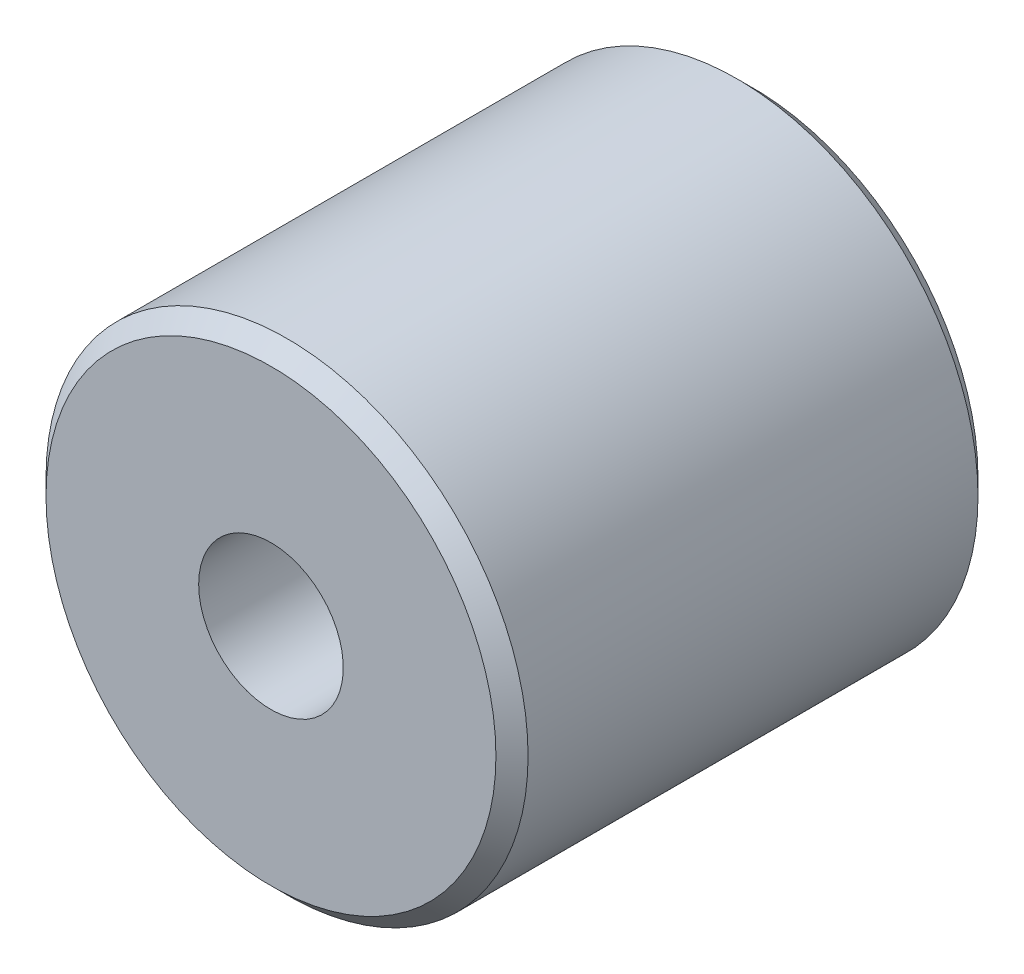
ISO-10303-21;
HEADER;
FILE_DESCRIPTION(('STEP AP214'),'2;1');
FILE_NAME('part.step','',(''),(''),'','','');
FILE_SCHEMA(('AUTOMOTIVE_DESIGN { 1 0 10303 214 1 1 1 1 }'));
ENDSEC;
DATA;
#1=APPLICATION_CONTEXT('core data for automotive mechanical design processes');
#2=APPLICATION_PROTOCOL_DEFINITION('international standard','automotive_design',2000,#1);
#3=PRODUCT_CONTEXT('',#1,'mechanical');
#4=PRODUCT('Part','Part','',(#3));
#5=PRODUCT_RELATED_PRODUCT_CATEGORY('part','',(#4));
#6=PRODUCT_DEFINITION_FORMATION('','',#4);
#7=PRODUCT_DEFINITION_CONTEXT('part definition',#1,'design');
#8=PRODUCT_DEFINITION('design','',#6,#7);
#9=PRODUCT_DEFINITION_SHAPE('','',#8);
#10=(LENGTH_UNIT() NAMED_UNIT(*) SI_UNIT(.MILLI.,.METRE.));
#11=(NAMED_UNIT(*) PLANE_ANGLE_UNIT() SI_UNIT($,.RADIAN.));
#12=(NAMED_UNIT(*) SI_UNIT($,.STERADIAN.) SOLID_ANGLE_UNIT());
#13=UNCERTAINTY_MEASURE_WITH_UNIT(LENGTH_MEASURE(1.E-05),#10,'distance_accuracy_value','');
#14=(GEOMETRIC_REPRESENTATION_CONTEXT(3) GLOBAL_UNCERTAINTY_ASSIGNED_CONTEXT((#13)) GLOBAL_UNIT_ASSIGNED_CONTEXT((#10,
#11,#12)) REPRESENTATION_CONTEXT('',''));
#15=CARTESIAN_POINT('',(0.,0.,0.));
#16=DIRECTION('',(0.,0.,1.));
#17=DIRECTION('',(1.,0.,0.));
#18=AXIS2_PLACEMENT_3D('',#15,#16,#17);
#19=CARTESIAN_POINT('',(-1.11022302462516E-13,-1.66533453693773E-13,0.));
#20=DIRECTION('',(0.,0.,-0.999999999999997));
#21=DIRECTION('',(-1.,0.,0.));
#22=AXIS2_PLACEMENT_3D('',#19,#20,#21);
#23=PLANE('',#22);
#24=CARTESIAN_POINT('',(-1.11022302462516E-13,-1.66533453693773E-13,0.));
#25=DIRECTION('',(0.,0.,-0.999999999999997));
#26=DIRECTION('',(-1.,0.,0.));
#27=AXIS2_PLACEMENT_3D('',#24,#25,#26);
#28=CIRCLE('',#27,14.);
#29=CARTESIAN_POINT('',(-14.0000000000001,-1.67116320781702E-13,0.));
#30=VERTEX_POINT('',#29);
#31=EDGE_CURVE('E62',#30,#30,#28,.F.);
#32=ORIENTED_EDGE('',*,*,#31,.T.);
#33=EDGE_LOOP('',(#32));
#34=FACE_BOUND('',#33,.T.);
#35=CARTESIAN_POINT('',(-1.11022302462516E-13,-1.66533453693773E-13,8.88178419700125E-13));
#36=DIRECTION('',(0.,0.,-0.999999999999997));
#37=DIRECTION('',(-1.,0.,0.));
#38=AXIS2_PLACEMENT_3D('',#35,#36,#37);
#39=CIRCLE('',#38,4.49999999999999);
#40=CARTESIAN_POINT('',(-4.50000000000009,-1.66720803829179E-13,8.84708972748172E-13));
#41=VERTEX_POINT('',#40);
#42=EDGE_CURVE('E76',#41,#41,#39,.T.);
#43=ORIENTED_EDGE('',*,*,#42,.T.);
#44=EDGE_LOOP('',(#43));
#45=FACE_BOUND('',#44,.T.);
#46=ADVANCED_FACE('F47',(#34,#45),#23,.F.);
#47=CARTESIAN_POINT('',(0.,-1.66533453693773E-13,2.83151327074194));
#48=DIRECTION('',(0.,0.,0.999999999999997));
#49=DIRECTION('',(1.,0.,0.));
#50=AXIS2_PLACEMENT_3D('',#47,#48,#49);
#51=CYLINDRICAL_SURFACE('',#50,15.);
#52=CARTESIAN_POINT('',(-1.11022302462516E-13,-1.66533453693773E-13,-1.00000000000033));
#53=DIRECTION('',(0.,0.,-0.999999999999997));
#54=DIRECTION('',(-1.,0.,0.));
#55=AXIS2_PLACEMENT_3D('',#52,#53,#54);
#56=CIRCLE('',#55,15.);
#57=CARTESIAN_POINT('',(14.9999999999999,-1.65908953242422E-13,-1.00000000000033));
#58=VERTEX_POINT('',#57);
#59=EDGE_CURVE('E54',#58,#58,#56,.T.);
#60=CARTESIAN_POINT('',(0.,-1.66533453693773E-13,-28.9999999999999));
#61=DIRECTION('',(0.,0.,0.999999999999997));
#62=DIRECTION('',(1.,0.,0.));
#63=AXIS2_PLACEMENT_3D('',#60,#61,#62);
#64=CIRCLE('',#63,15.);
#65=CARTESIAN_POINT('',(14.9999999999999,-1.65908953242422E-13,-28.9999999999999));
#66=VERTEX_POINT('',#65);
#67=EDGE_CURVE('E58',#66,#66,#64,.T.);
#68=CARTESIAN_POINT('',(14.9999999999999,-1.65908953242422E-13,-1.00000000000033));
#69=CARTESIAN_POINT('',(14.9999999999999,-1.65908953242422E-13,-1.291666666667));
#70=CARTESIAN_POINT('',(14.9999999999999,-1.65908953242422E-13,-1.58333333333366));
#71=CARTESIAN_POINT('',(14.9999999999999,-1.65908953242422E-13,-2.16666666666698));
#72=CARTESIAN_POINT('',(14.9999999999999,-1.65908953242422E-13,-2.45833333333365));
#73=CARTESIAN_POINT('',(14.9999999999999,-1.65908953242422E-13,-3.04166666666697));
#74=CARTESIAN_POINT('',(14.9999999999999,-1.65908953242422E-13,-3.33333333333363));
#75=CARTESIAN_POINT('',(14.9999999999999,-1.65908953242422E-13,-3.91666666666696));
#76=CARTESIAN_POINT('',(14.9999999999999,-1.65908953242422E-13,-4.20833333333362));
#77=CARTESIAN_POINT('',(14.9999999999999,-1.65908953242422E-13,-4.79166666666694));
#78=CARTESIAN_POINT('',(14.9999999999999,-1.65908953242422E-13,-5.0833333333336));
#79=CARTESIAN_POINT('',(14.9999999999999,-1.65908953242422E-13,-5.66666666666693));
#80=CARTESIAN_POINT('',(14.9999999999999,-1.65908953242422E-13,-5.95833333333359));
#81=CARTESIAN_POINT('',(14.9999999999999,-1.65908953242422E-13,-6.54166666666692));
#82=CARTESIAN_POINT('',(14.9999999999999,-1.65908953242422E-13,-6.83333333333358));
#83=CARTESIAN_POINT('',(14.9999999999999,-1.65908953242422E-13,-7.4166666666669));
#84=CARTESIAN_POINT('',(14.9999999999999,-1.65908953242422E-13,-7.70833333333357));
#85=CARTESIAN_POINT('',(14.9999999999999,-1.65908953242422E-13,-8.29166666666689));
#86=CARTESIAN_POINT('',(14.9999999999999,-1.65908953242422E-13,-8.58333333333355));
#87=CARTESIAN_POINT('',(14.9999999999999,-1.65908953242422E-13,-9.16666666666688));
#88=CARTESIAN_POINT('',(14.9999999999999,-1.65908953242422E-13,-9.45833333333354));
#89=CARTESIAN_POINT('',(14.9999999999999,-1.65908953242422E-13,-10.0416666666669));
#90=CARTESIAN_POINT('',(14.9999999999999,-1.65908953242422E-13,-10.3333333333335));
#91=CARTESIAN_POINT('',(14.9999999999999,-1.65908953242422E-13,-10.9166666666669));
#92=CARTESIAN_POINT('',(14.9999999999999,-1.65908953242422E-13,-11.2083333333335));
#93=CARTESIAN_POINT('',(14.9999999999999,-1.65908953242422E-13,-11.7916666666668));
#94=CARTESIAN_POINT('',(14.9999999999999,-1.65908953242422E-13,-12.0833333333335));
#95=CARTESIAN_POINT('',(14.9999999999999,-1.65908953242422E-13,-12.6666666666668));
#96=CARTESIAN_POINT('',(14.9999999999999,-1.65908953242422E-13,-12.9583333333335));
#97=CARTESIAN_POINT('',(14.9999999999999,-1.65908953242422E-13,-13.5416666666668));
#98=CARTESIAN_POINT('',(14.9999999999999,-1.65908953242422E-13,-13.8333333333335));
#99=CARTESIAN_POINT('',(14.9999999999999,-1.65908953242422E-13,-14.4166666666668));
#100=CARTESIAN_POINT('',(14.9999999999999,-1.65908953242422E-13,-14.7083333333335));
#101=CARTESIAN_POINT('',(14.9999999999999,-1.65908953242422E-13,-15.2916666666668));
#102=CARTESIAN_POINT('',(14.9999999999999,-1.65908953242422E-13,-15.5833333333334));
#103=CARTESIAN_POINT('',(14.9999999999999,-1.65908953242422E-13,-16.1666666666668));
#104=CARTESIAN_POINT('',(14.9999999999999,-1.65908953242422E-13,-16.4583333333334));
#105=CARTESIAN_POINT('',(14.9999999999999,-1.65908953242422E-13,-17.0416666666668));
#106=CARTESIAN_POINT('',(14.9999999999999,-1.65908953242422E-13,-17.3333333333334));
#107=CARTESIAN_POINT('',(14.9999999999999,-1.65908953242422E-13,-17.9166666666667));
#108=CARTESIAN_POINT('',(14.9999999999999,-1.65908953242422E-13,-18.2083333333334));
#109=CARTESIAN_POINT('',(14.9999999999999,-1.65908953242422E-13,-18.7916666666667));
#110=CARTESIAN_POINT('',(14.9999999999999,-1.65908953242422E-13,-19.0833333333334));
#111=CARTESIAN_POINT('',(14.9999999999999,-1.65908953242422E-13,-19.6666666666667));
#112=CARTESIAN_POINT('',(14.9999999999999,-1.65908953242422E-13,-19.9583333333334));
#113=CARTESIAN_POINT('',(14.9999999999999,-1.65908953242422E-13,-20.5416666666667));
#114=CARTESIAN_POINT('',(14.9999999999999,-1.65908953242422E-13,-20.8333333333334));
#115=CARTESIAN_POINT('',(14.9999999999999,-1.65908953242422E-13,-21.4166666666667));
#116=CARTESIAN_POINT('',(14.9999999999999,-1.65908953242422E-13,-21.7083333333334));
#117=CARTESIAN_POINT('',(14.9999999999999,-1.65908953242422E-13,-22.2916666666667));
#118=CARTESIAN_POINT('',(14.9999999999999,-1.65908953242422E-13,-22.5833333333333));
#119=CARTESIAN_POINT('',(14.9999999999999,-1.65908953242422E-13,-23.1666666666667));
#120=CARTESIAN_POINT('',(14.9999999999999,-1.65908953242422E-13,-23.4583333333333));
#121=CARTESIAN_POINT('',(14.9999999999999,-1.65908953242422E-13,-24.0416666666667));
#122=CARTESIAN_POINT('',(14.9999999999999,-1.65908953242422E-13,-24.3333333333333));
#123=CARTESIAN_POINT('',(14.9999999999999,-1.65908953242422E-13,-24.9166666666666));
#124=CARTESIAN_POINT('',(14.9999999999999,-1.65908953242422E-13,-25.2083333333333));
#125=CARTESIAN_POINT('',(14.9999999999999,-1.65908953242422E-13,-25.7916666666666));
#126=CARTESIAN_POINT('',(14.9999999999999,-1.65908953242422E-13,-26.0833333333333));
#127=CARTESIAN_POINT('',(14.9999999999999,-1.65908953242422E-13,-26.6666666666666));
#128=CARTESIAN_POINT('',(14.9999999999999,-1.65908953242422E-13,-26.9583333333333));
#129=CARTESIAN_POINT('',(14.9999999999999,-1.65908953242422E-13,-27.5416666666666));
#130=CARTESIAN_POINT('',(14.9999999999999,-1.65908953242422E-13,-27.8333333333333));
#131=CARTESIAN_POINT('',(14.9999999999999,-1.65908953242422E-13,-28.4166666666666));
#132=CARTESIAN_POINT('',(14.9999999999999,-1.65908953242422E-13,-28.7083333333333));
#133=CARTESIAN_POINT('',(14.9999999999999,-1.65908953242422E-13,-28.9999999999999));
#134=B_SPLINE_CURVE_WITH_KNOTS('',3,(#68,#69,#70,#71,#72,#73,#74,#75,#76,#77,#78,#79,#80,#81,
#82,#83,#84,#85,#86,#87,#88,#89,#90,#91,#92,#93,#94,#95,#96,#97,#98,#99,#100,#101,#102,#103,
#104,#105,#106,#107,#108,#109,#110,#111,#112,#113,#114,#115,#116,#117,#118,#119,#120,#121,#122,
#123,#124,#125,#126,#127,#128,#129,#130,#131,#132,#133),.UNSPECIFIED.,.F.,.F.,(4,2,2,2,2,2,2,2,
2,2,2,2,2,2,2,2,2,2,2,2,2,2,2,2,2,2,2,2,2,2,2,2,4),(0.,0.874999999999988,1.74999999999997,
2.62499999999996,3.49999999999995,4.37499999999993,5.24999999999992,6.12499999999991,
6.99999999999989,7.87499999999988,8.74999999999987,9.62499999999985,10.4999999999998,
11.3749999999998,12.2499999999998,13.1249999999998,13.9999999999998,14.8749999999998,
15.7499999999998,16.6249999999997,17.4999999999997,18.3749999999997,19.2499999999997,
20.1249999999997,20.9999999999997,21.8749999999997,22.7499999999997,23.6249999999996,
24.4999999999996,25.3749999999996,26.2499999999996,27.1249999999996,27.9999999999996),.UNSPECIFIED.);
#135=EDGE_CURVE('BSEAM102',#58,#66,#134,.T.);
#136=ORIENTED_EDGE('',*,*,#59,.T.);
#137=ORIENTED_EDGE('',*,*,#67,.T.);
#138=ORIENTED_EDGE('',*,*,#135,.T.);
#139=ORIENTED_EDGE('',*,*,#135,.F.);
#140=EDGE_LOOP('',(#136,#138,#137,#139));
#141=FACE_BOUND('',#140,.T.);
#142=ADVANCED_FACE('F102',(#141),#51,.T.);
#143=CARTESIAN_POINT('',(0.,15.,-30.0000000000002));
#144=DIRECTION('',(0.,0.,0.999999999999997));
#145=DIRECTION('',(1.,0.,0.));
#146=AXIS2_PLACEMENT_3D('',#143,#144,#145);
#147=PLANE('',#146);
#148=CARTESIAN_POINT('',(0.,-1.66533453693773E-13,-30.0000000000002));
#149=DIRECTION('',(0.,0.,0.999999999999997));
#150=DIRECTION('',(1.,0.,0.));
#151=AXIS2_PLACEMENT_3D('',#148,#149,#150);
#152=CIRCLE('',#151,14.);
#153=CARTESIAN_POINT('',(13.9999999999996,-1.65950586605845E-13,-30.0000000000002));
#154=VERTEX_POINT('',#153);
#155=EDGE_CURVE('E11',#154,#154,#152,.F.);
#156=ORIENTED_EDGE('',*,*,#155,.T.);
#157=EDGE_LOOP('',(#156));
#158=FACE_BOUND('',#157,.T.);
#159=CARTESIAN_POINT('',(0.,-1.66533453693773E-13,-30.0000000000002));
#160=DIRECTION('',(0.,0.,-0.999999999999997));
#161=DIRECTION('',(-1.,0.,0.));
#162=AXIS2_PLACEMENT_3D('',#159,#160,#161);
#163=CIRCLE('',#162,7.5);
#164=CARTESIAN_POINT('',(-7.50000000000009,-1.66845703919449E-13,-30.0000000000002));
#165=VERTEX_POINT('',#164);
#166=EDGE_CURVE('E67',#165,#165,#163,.T.);
#167=ORIENTED_EDGE('',*,*,#166,.F.);
#168=EDGE_LOOP('',(#167));
#169=FACE_BOUND('',#168,.T.);
#170=ADVANCED_FACE('F97',(#158,#169),#147,.F.);
#171=CARTESIAN_POINT('',(0.,-1.66533453693773E-13,-30.0000000000002));
#172=DIRECTION('',(0.,0.,-0.999999999999997));
#173=DIRECTION('',(-1.,0.,0.));
#174=AXIS2_PLACEMENT_3D('',#171,#172,#173);
#175=CYLINDRICAL_SURFACE('',#174,7.5);
#176=CARTESIAN_POINT('',(0.,0.,-22.0000000000002));
#177=DIRECTION('',(0.,0.,-0.999999999999997));
#178=DIRECTION('',(-1.,0.,0.));
#179=AXIS2_PLACEMENT_3D('',#176,#177,#178);
#180=CIRCLE('',#179,7.5);
#181=CARTESIAN_POINT('',(-7.50000000000009,-1.66845703919449E-13,-22.0000000000002));
#182=VERTEX_POINT('',#181);
#183=EDGE_CURVE('E70',#182,#182,#180,.T.);
#184=CARTESIAN_POINT('',(-7.50000000000009,-1.66845703919449E-13,-22.0000000000002));
#185=CARTESIAN_POINT('',(-7.50000000000009,-1.66845703919449E-13,-22.0833333333336));
#186=CARTESIAN_POINT('',(-7.50000000000009,-1.66845703919449E-13,-22.1666666666669));
#187=CARTESIAN_POINT('',(-7.50000000000009,-1.66845703919449E-13,-22.3333333333336));
#188=CARTESIAN_POINT('',(-7.50000000000009,-1.66845703919449E-13,-22.4166666666669));
#189=CARTESIAN_POINT('',(-7.50000000000009,-1.66845703919449E-13,-22.5833333333336));
#190=CARTESIAN_POINT('',(-7.50000000000009,-1.66845703919449E-13,-22.6666666666669));
#191=CARTESIAN_POINT('',(-7.50000000000009,-1.66845703919449E-13,-22.8333333333336));
#192=CARTESIAN_POINT('',(-7.50000000000009,-1.66845703919449E-13,-22.9166666666669));
#193=CARTESIAN_POINT('',(-7.50000000000009,-1.66845703919449E-13,-23.0833333333336));
#194=CARTESIAN_POINT('',(-7.50000000000009,-1.66845703919449E-13,-23.1666666666669));
#195=CARTESIAN_POINT('',(-7.50000000000009,-1.66845703919449E-13,-23.3333333333336));
#196=CARTESIAN_POINT('',(-7.50000000000009,-1.66845703919449E-13,-23.4166666666669));
#197=CARTESIAN_POINT('',(-7.50000000000009,-1.66845703919449E-13,-23.5833333333336));
#198=CARTESIAN_POINT('',(-7.50000000000009,-1.66845703919449E-13,-23.6666666666669));
#199=CARTESIAN_POINT('',(-7.50000000000009,-1.66845703919449E-13,-23.8333333333336));
#200=CARTESIAN_POINT('',(-7.50000000000009,-1.66845703919449E-13,-23.9166666666669));
#201=CARTESIAN_POINT('',(-7.50000000000009,-1.66845703919449E-13,-24.0833333333336));
#202=CARTESIAN_POINT('',(-7.50000000000009,-1.66845703919449E-13,-24.1666666666669));
#203=CARTESIAN_POINT('',(-7.50000000000009,-1.66845703919449E-13,-24.3333333333336));
#204=CARTESIAN_POINT('',(-7.50000000000009,-1.66845703919449E-13,-24.4166666666669));
#205=CARTESIAN_POINT('',(-7.50000000000009,-1.66845703919449E-13,-24.5833333333336));
#206=CARTESIAN_POINT('',(-7.50000000000009,-1.66845703919449E-13,-24.6666666666669));
#207=CARTESIAN_POINT('',(-7.50000000000009,-1.66845703919449E-13,-24.8333333333336));
#208=CARTESIAN_POINT('',(-7.50000000000009,-1.66845703919449E-13,-24.9166666666669));
#209=CARTESIAN_POINT('',(-7.50000000000009,-1.66845703919449E-13,-25.0833333333336));
#210=CARTESIAN_POINT('',(-7.50000000000009,-1.66845703919449E-13,-25.1666666666669));
#211=CARTESIAN_POINT('',(-7.50000000000009,-1.66845703919449E-13,-25.3333333333336));
#212=CARTESIAN_POINT('',(-7.50000000000009,-1.66845703919449E-13,-25.4166666666669));
#213=CARTESIAN_POINT('',(-7.50000000000009,-1.66845703919449E-13,-25.5833333333336));
#214=CARTESIAN_POINT('',(-7.50000000000009,-1.66845703919449E-13,-25.6666666666669));
#215=CARTESIAN_POINT('',(-7.50000000000009,-1.66845703919449E-13,-25.8333333333336));
#216=CARTESIAN_POINT('',(-7.50000000000009,-1.66845703919449E-13,-25.9166666666669));
#217=CARTESIAN_POINT('',(-7.50000000000009,-1.66845703919449E-13,-26.0833333333336));
#218=CARTESIAN_POINT('',(-7.50000000000009,-1.66845703919449E-13,-26.1666666666669));
#219=CARTESIAN_POINT('',(-7.50000000000009,-1.66845703919449E-13,-26.3333333333336));
#220=CARTESIAN_POINT('',(-7.50000000000009,-1.66845703919449E-13,-26.4166666666669));
#221=CARTESIAN_POINT('',(-7.50000000000009,-1.66845703919449E-13,-26.5833333333336));
#222=CARTESIAN_POINT('',(-7.50000000000009,-1.66845703919449E-13,-26.6666666666669));
#223=CARTESIAN_POINT('',(-7.50000000000009,-1.66845703919449E-13,-26.8333333333336));
#224=CARTESIAN_POINT('',(-7.50000000000009,-1.66845703919449E-13,-26.9166666666669));
#225=CARTESIAN_POINT('',(-7.50000000000009,-1.66845703919449E-13,-27.0833333333336));
#226=CARTESIAN_POINT('',(-7.50000000000009,-1.66845703919449E-13,-27.1666666666669));
#227=CARTESIAN_POINT('',(-7.50000000000009,-1.66845703919449E-13,-27.3333333333336));
#228=CARTESIAN_POINT('',(-7.50000000000009,-1.66845703919449E-13,-27.4166666666669));
#229=CARTESIAN_POINT('',(-7.50000000000009,-1.66845703919449E-13,-27.5833333333336));
#230=CARTESIAN_POINT('',(-7.50000000000009,-1.66845703919449E-13,-27.6666666666669));
#231=CARTESIAN_POINT('',(-7.50000000000009,-1.66845703919449E-13,-27.8333333333336));
#232=CARTESIAN_POINT('',(-7.50000000000009,-1.66845703919449E-13,-27.9166666666669));
#233=CARTESIAN_POINT('',(-7.50000000000009,-1.66845703919449E-13,-28.0833333333336));
#234=CARTESIAN_POINT('',(-7.50000000000009,-1.66845703919449E-13,-28.1666666666669));
#235=CARTESIAN_POINT('',(-7.50000000000009,-1.66845703919449E-13,-28.3333333333336));
#236=CARTESIAN_POINT('',(-7.50000000000009,-1.66845703919449E-13,-28.4166666666669));
#237=CARTESIAN_POINT('',(-7.50000000000009,-1.66845703919449E-13,-28.5833333333336));
#238=CARTESIAN_POINT('',(-7.50000000000009,-1.66845703919449E-13,-28.6666666666669));
#239=CARTESIAN_POINT('',(-7.50000000000009,-1.66845703919449E-13,-28.8333333333336));
#240=CARTESIAN_POINT('',(-7.50000000000009,-1.66845703919449E-13,-28.9166666666669));
#241=CARTESIAN_POINT('',(-7.50000000000009,-1.66845703919449E-13,-29.0833333333336));
#242=CARTESIAN_POINT('',(-7.50000000000009,-1.66845703919449E-13,-29.1666666666669));
#243=CARTESIAN_POINT('',(-7.50000000000009,-1.66845703919449E-13,-29.3333333333336));
#244=CARTESIAN_POINT('',(-7.50000000000009,-1.66845703919449E-13,-29.4166666666669));
#245=CARTESIAN_POINT('',(-7.50000000000009,-1.66845703919449E-13,-29.5833333333336));
#246=CARTESIAN_POINT('',(-7.50000000000009,-1.66845703919449E-13,-29.6666666666669));
#247=CARTESIAN_POINT('',(-7.50000000000009,-1.66845703919449E-13,-29.8333333333336));
#248=CARTESIAN_POINT('',(-7.50000000000009,-1.66845703919449E-13,-29.9166666666669));
#249=CARTESIAN_POINT('',(-7.50000000000009,-1.66845703919449E-13,-30.0000000000002));
#250=B_SPLINE_CURVE_WITH_KNOTS('',3,(#184,#185,#186,#187,#188,#189,#190,#191,#192,#193,#194,
#195,#196,#197,#198,#199,#200,#201,#202,#203,#204,#205,#206,#207,#208,#209,#210,#211,#212,#213,
#214,#215,#216,#217,#218,#219,#220,#221,#222,#223,#224,#225,#226,#227,#228,#229,#230,#231,#232,
#233,#234,#235,#236,#237,#238,#239,#240,#241,#242,#243,#244,#245,#246,#247,#248,#249),
.UNSPECIFIED.,.F.,.F.,(4,2,2,2,2,2,2,2,2,2,2,2,2,2,2,2,2,2,2,2,2,2,2,2,2,2,2,2,2,2,2,2,4),(0.,
0.25,0.5,0.750000000000001,1.,1.25,1.5,1.75,2.,2.25,2.5,2.75,3.,3.25,3.5,3.75,4.,4.25,4.5,4.75,
5.,5.25,5.50000000000001,5.75000000000001,6.,6.25000000000001,6.50000000000001,6.75000000000001,
7.,7.25000000000001,7.50000000000001,7.75,8.),.UNSPECIFIED.);
#251=EDGE_CURVE('BSEAM91',#182,#165,#250,.T.);
#252=ORIENTED_EDGE('',*,*,#183,.F.);
#253=ORIENTED_EDGE('',*,*,#166,.T.);
#254=ORIENTED_EDGE('',*,*,#251,.T.);
#255=ORIENTED_EDGE('',*,*,#251,.F.);
#256=EDGE_LOOP('',(#252,#254,#253,#255));
#257=FACE_BOUND('',#256,.T.);
#258=ADVANCED_FACE('F91',(#257),#175,.F.);
#259=CARTESIAN_POINT('',(4.50000000000014,0.,-22.0000000000002));
#260=DIRECTION('',(0.,0.,0.999999999999997));
#261=DIRECTION('',(1.,0.,0.));
#262=AXIS2_PLACEMENT_3D('',#259,#260,#261);
#263=PLANE('',#262);
#264=CARTESIAN_POINT('',(0.,0.,-22.0000000000002));
#265=DIRECTION('',(0.,0.,-0.999999999999997));
#266=DIRECTION('',(-1.,0.,0.));
#267=AXIS2_PLACEMENT_3D('',#264,#265,#266);
#268=CIRCLE('',#267,4.5);
#269=CARTESIAN_POINT('',(-4.50000000000009,-1.66720803829179E-13,-22.0000000000002));
#270=VERTEX_POINT('',#269);
#271=EDGE_CURVE('E73',#270,#270,#268,.T.);
#272=ORIENTED_EDGE('',*,*,#271,.F.);
#273=EDGE_LOOP('',(#272));
#274=FACE_BOUND('',#273,.T.);
#275=ORIENTED_EDGE('',*,*,#183,.T.);
#276=EDGE_LOOP('',(#275));
#277=FACE_BOUND('',#276,.T.);
#278=ADVANCED_FACE('F85',(#274,#277),#263,.F.);
#279=CARTESIAN_POINT('',(0.,-1.66533453693773E-13,-30.0000000000002));
#280=DIRECTION('',(0.,0.,-0.999999999999997));
#281=DIRECTION('',(-1.,0.,0.));
#282=AXIS2_PLACEMENT_3D('',#279,#280,#281);
#283=CYLINDRICAL_SURFACE('',#282,4.5);
#284=CARTESIAN_POINT('',(-4.50000000000009,-1.66720803829179E-13,8.84708972748172E-13));
#285=CARTESIAN_POINT('',(-4.50000000000009,-1.66720803829179E-13,-0.229166666665795));
#286=CARTESIAN_POINT('',(-4.50000000000009,-1.66720803829179E-13,-0.458333333332475));
#287=CARTESIAN_POINT('',(-4.50000000000009,-1.66720803829179E-13,-0.916666666665831));
#288=CARTESIAN_POINT('',(-4.50000000000009,-1.66720803829179E-13,-1.14583333333251));
#289=CARTESIAN_POINT('',(-4.50000000000009,-1.66720803829179E-13,-1.60416666666586));
#290=CARTESIAN_POINT('',(-4.50000000000009,-1.66720803829179E-13,-1.83333333333254));
#291=CARTESIAN_POINT('',(-4.50000000000009,-1.66720803829179E-13,-2.2916666666659));
#292=CARTESIAN_POINT('',(-4.50000000000009,-1.66720803829179E-13,-2.52083333333258));
#293=CARTESIAN_POINT('',(-4.50000000000009,-1.66720803829179E-13,-2.97916666666593));
#294=CARTESIAN_POINT('',(-4.50000000000009,-1.66720803829179E-13,-3.20833333333261));
#295=CARTESIAN_POINT('',(-4.50000000000009,-1.66720803829179E-13,-3.66666666666597));
#296=CARTESIAN_POINT('',(-4.50000000000009,-1.66720803829179E-13,-3.89583333333265));
#297=CARTESIAN_POINT('',(-4.50000000000009,-1.66720803829179E-13,-4.35416666666601));
#298=CARTESIAN_POINT('',(-4.50000000000009,-1.66720803829179E-13,-4.58333333333268));
#299=CARTESIAN_POINT('',(-4.50000000000009,-1.66720803829179E-13,-5.04166666666604));
#300=CARTESIAN_POINT('',(-4.50000000000009,-1.66720803829179E-13,-5.27083333333272));
#301=CARTESIAN_POINT('',(-4.50000000000009,-1.66720803829179E-13,-5.72916666666608));
#302=CARTESIAN_POINT('',(-4.50000000000009,-1.66720803829179E-13,-5.95833333333275));
#303=CARTESIAN_POINT('',(-4.50000000000009,-1.66720803829179E-13,-6.41666666666611));
#304=CARTESIAN_POINT('',(-4.50000000000009,-1.66720803829179E-13,-6.64583333333279));
#305=CARTESIAN_POINT('',(-4.50000000000009,-1.66720803829179E-13,-7.10416666666615));
#306=CARTESIAN_POINT('',(-4.50000000000009,-1.66720803829179E-13,-7.33333333333282));
#307=CARTESIAN_POINT('',(-4.50000000000009,-1.66720803829179E-13,-7.79166666666618));
#308=CARTESIAN_POINT('',(-4.50000000000009,-1.66720803829179E-13,-8.02083333333286));
#309=CARTESIAN_POINT('',(-4.50000000000009,-1.66720803829179E-13,-8.47916666666622));
#310=CARTESIAN_POINT('',(-4.50000000000009,-1.66720803829179E-13,-8.7083333333329));
#311=CARTESIAN_POINT('',(-4.50000000000009,-1.66720803829179E-13,-9.16666666666625));
#312=CARTESIAN_POINT('',(-4.50000000000009,-1.66720803829179E-13,-9.39583333333293));
#313=CARTESIAN_POINT('',(-4.50000000000009,-1.66720803829179E-13,-9.85416666666629));
#314=CARTESIAN_POINT('',(-4.50000000000009,-1.66720803829179E-13,-10.083333333333));
#315=CARTESIAN_POINT('',(-4.50000000000009,-1.66720803829179E-13,-10.5416666666663));
#316=CARTESIAN_POINT('',(-4.50000000000009,-1.66720803829179E-13,-10.770833333333));
#317=CARTESIAN_POINT('',(-4.50000000000009,-1.66720803829179E-13,-11.2291666666664));
#318=CARTESIAN_POINT('',(-4.50000000000009,-1.66720803829179E-13,-11.458333333333));
#319=CARTESIAN_POINT('',(-4.50000000000009,-1.66720803829179E-13,-11.9166666666664));
#320=CARTESIAN_POINT('',(-4.50000000000009,-1.66720803829179E-13,-12.1458333333331));
#321=CARTESIAN_POINT('',(-4.50000000000009,-1.66720803829179E-13,-12.6041666666664));
#322=CARTESIAN_POINT('',(-4.50000000000009,-1.66720803829179E-13,-12.8333333333331));
#323=CARTESIAN_POINT('',(-4.50000000000009,-1.66720803829179E-13,-13.2916666666665));
#324=CARTESIAN_POINT('',(-4.50000000000009,-1.66720803829179E-13,-13.5208333333331));
#325=CARTESIAN_POINT('',(-4.50000000000009,-1.66720803829179E-13,-13.9791666666665));
#326=CARTESIAN_POINT('',(-4.50000000000009,-1.66720803829179E-13,-14.2083333333332));
#327=CARTESIAN_POINT('',(-4.50000000000009,-1.66720803829179E-13,-14.6666666666665));
#328=CARTESIAN_POINT('',(-4.50000000000009,-1.66720803829179E-13,-14.8958333333332));
#329=CARTESIAN_POINT('',(-4.50000000000009,-1.66720803829179E-13,-15.3541666666666));
#330=CARTESIAN_POINT('',(-4.50000000000009,-1.66720803829179E-13,-15.5833333333332));
#331=CARTESIAN_POINT('',(-4.50000000000009,-1.66720803829179E-13,-16.0416666666666));
#332=CARTESIAN_POINT('',(-4.50000000000009,-1.66720803829179E-13,-16.2708333333333));
#333=CARTESIAN_POINT('',(-4.50000000000009,-1.66720803829179E-13,-16.7291666666666));
#334=CARTESIAN_POINT('',(-4.50000000000009,-1.66720803829179E-13,-16.9583333333333));
#335=CARTESIAN_POINT('',(-4.50000000000009,-1.66720803829179E-13,-17.4166666666667));
#336=CARTESIAN_POINT('',(-4.50000000000009,-1.66720803829179E-13,-17.6458333333334));
#337=CARTESIAN_POINT('',(-4.50000000000009,-1.66720803829179E-13,-18.1041666666667));
#338=CARTESIAN_POINT('',(-4.50000000000009,-1.66720803829179E-13,-18.3333333333334));
#339=CARTESIAN_POINT('',(-4.50000000000009,-1.66720803829179E-13,-18.7916666666667));
#340=CARTESIAN_POINT('',(-4.50000000000009,-1.66720803829179E-13,-19.0208333333334));
#341=CARTESIAN_POINT('',(-4.50000000000009,-1.66720803829179E-13,-19.4791666666668));
#342=CARTESIAN_POINT('',(-4.50000000000009,-1.66720803829179E-13,-19.7083333333335));
#343=CARTESIAN_POINT('',(-4.50000000000009,-1.66720803829179E-13,-20.1666666666668));
#344=CARTESIAN_POINT('',(-4.50000000000009,-1.66720803829179E-13,-20.3958333333335));
#345=CARTESIAN_POINT('',(-4.50000000000009,-1.66720803829179E-13,-20.8541666666668));
#346=CARTESIAN_POINT('',(-4.50000000000009,-1.66720803829179E-13,-21.0833333333335));
#347=CARTESIAN_POINT('',(-4.50000000000009,-1.66720803829179E-13,-21.5416666666669));
#348=CARTESIAN_POINT('',(-4.50000000000009,-1.66720803829179E-13,-21.7708333333336));
#349=CARTESIAN_POINT('',(-4.50000000000009,-1.66720803829179E-13,-22.0000000000002));
#350=B_SPLINE_CURVE_WITH_KNOTS('',3,(#284,#285,#286,#287,#288,#289,#290,#291,#292,#293,#294,
#295,#296,#297,#298,#299,#300,#301,#302,#303,#304,#305,#306,#307,#308,#309,#310,#311,#312,#313,
#314,#315,#316,#317,#318,#319,#320,#321,#322,#323,#324,#325,#326,#327,#328,#329,#330,#331,#332,
#333,#334,#335,#336,#337,#338,#339,#340,#341,#342,#343,#344,#345,#346,#347,#348,#349),
.UNSPECIFIED.,.F.,.F.,(4,2,2,2,2,2,2,2,2,2,2,2,2,2,2,2,2,2,2,2,2,2,2,2,2,2,2,2,2,2,2,2,4),(0.,
0.687500000000039,1.37500000000007,2.06250000000011,2.75000000000014,3.43750000000018,
4.12500000000021,4.81250000000025,5.50000000000028,6.18750000000032,6.87500000000035,
7.56250000000039,8.25000000000042,8.93750000000046,9.6250000000005,10.3125000000005,
11.0000000000006,11.6875000000006,12.3750000000006,13.0625000000007,13.7500000000007,
14.4375000000007,15.1250000000008,15.8125000000008,16.5000000000008,17.1875000000009,
17.8750000000009,18.562500000001,19.250000000001,19.937500000001,20.6250000000011,
21.3125000000011,22.0000000000011),.UNSPECIFIED.);
#351=EDGE_CURVE('BSEAM81',#41,#270,#350,.T.);
#352=ORIENTED_EDGE('',*,*,#42,.F.);
#353=ORIENTED_EDGE('',*,*,#271,.T.);
#354=ORIENTED_EDGE('',*,*,#351,.T.);
#355=ORIENTED_EDGE('',*,*,#351,.F.);
#356=EDGE_LOOP('',(#352,#354,#353,#355));
#357=FACE_BOUND('',#356,.T.);
#358=ADVANCED_FACE('F81',(#357),#283,.F.);
#359=CARTESIAN_POINT('',(-1.11022302462516E-13,-1.66533453693773E-13,0.));
#360=DIRECTION('',(0.,0.,-0.999999999999997));
#361=DIRECTION('',(-1.,0.,0.));
#362=AXIS2_PLACEMENT_3D('',#359,#360,#361);
#363=CONICAL_SURFACE('',#362,14.,0.785398163397448);
#364=ORIENTED_EDGE('',*,*,#59,.F.);
#365=EDGE_LOOP('',(#364));
#366=FACE_BOUND('',#365,.T.);
#367=ORIENTED_EDGE('',*,*,#31,.F.);
#368=EDGE_LOOP('',(#367));
#369=FACE_BOUND('',#368,.T.);
#370=ADVANCED_FACE('F84',(#366,#369),#363,.T.);
#371=CARTESIAN_POINT('',(0.,-1.66533453693773E-13,-28.9999999999999));
#372=DIRECTION('',(0.,0.,0.999999999999997));
#373=DIRECTION('',(1.,0.,0.));
#374=AXIS2_PLACEMENT_3D('',#371,#372,#373);
#375=CONICAL_SURFACE('',#374,15.,0.785398163397449);
#376=CARTESIAN_POINT('',(13.9999999999996,-1.65950586605845E-13,-30.0000000000002));
#377=CARTESIAN_POINT('',(14.0104166666663,-1.65950152924976E-13,-29.9895833333336));
#378=CARTESIAN_POINT('',(14.0208333333329,-1.65949719244107E-13,-29.9791666666669));
#379=CARTESIAN_POINT('',(14.0416666666663,-1.65948851882369E-13,-29.9583333333336));
#380=CARTESIAN_POINT('',(14.052083333333,-1.659484182015E-13,-29.9479166666669));
#381=CARTESIAN_POINT('',(14.0729166666663,-1.65947550839762E-13,-29.9270833333336));
#382=CARTESIAN_POINT('',(14.083333333333,-1.65947117158893E-13,-29.9166666666669));
#383=CARTESIAN_POINT('',(14.1041666666663,-1.65946249797155E-13,-29.8958333333335));
#384=CARTESIAN_POINT('',(14.114583333333,-1.65945816116286E-13,-29.8854166666669));
#385=CARTESIAN_POINT('',(14.1354166666663,-1.65944948754548E-13,-29.8645833333335));
#386=CARTESIAN_POINT('',(14.145833333333,-1.65944515073679E-13,-29.8541666666669));
#387=CARTESIAN_POINT('',(14.1666666666663,-1.65943647711941E-13,-29.8333333333335));
#388=CARTESIAN_POINT('',(14.177083333333,-1.65943214031072E-13,-29.8229166666669));
#389=CARTESIAN_POINT('',(14.1979166666663,-1.65942346669334E-13,-29.8020833333335));
#390=CARTESIAN_POINT('',(14.208333333333,-1.65941912988465E-13,-29.7916666666668));
#391=CARTESIAN_POINT('',(14.2291666666663,-1.65941045626727E-13,-29.7708333333335));
#392=CARTESIAN_POINT('',(14.239583333333,-1.65940611945858E-13,-29.7604166666668));
#393=CARTESIAN_POINT('',(14.2604166666664,-1.6593974458412E-13,-29.7395833333335));
#394=CARTESIAN_POINT('',(14.270833333333,-1.65939310903251E-13,-29.7291666666668));
#395=CARTESIAN_POINT('',(14.2916666666664,-1.65938443541513E-13,-29.7083333333335));
#396=CARTESIAN_POINT('',(14.302083333333,-1.65938009860644E-13,-29.6979166666668));
#397=CARTESIAN_POINT('',(14.3229166666664,-1.65937142498906E-13,-29.6770833333335));
#398=CARTESIAN_POINT('',(14.333333333333,-1.65936708818037E-13,-29.6666666666668));
#399=CARTESIAN_POINT('',(14.3541666666664,-1.65935841456299E-13,-29.6458333333335));
#400=CARTESIAN_POINT('',(14.3645833333331,-1.65935407775431E-13,-29.6354166666668));
#401=CARTESIAN_POINT('',(14.3854166666664,-1.65934540413692E-13,-29.6145833333334));
#402=CARTESIAN_POINT('',(14.3958333333331,-1.65934106732823E-13,-29.6041666666668));
#403=CARTESIAN_POINT('',(14.4166666666664,-1.65933239371086E-13,-29.5833333333334));
#404=CARTESIAN_POINT('',(14.4270833333331,-1.65932805690217E-13,-29.5729166666668));
#405=CARTESIAN_POINT('',(14.4479166666664,-1.65931938328479E-13,-29.5520833333334));
#406=CARTESIAN_POINT('',(14.4583333333331,-1.6593150464761E-13,-29.5416666666668));
#407=CARTESIAN_POINT('',(14.4791666666664,-1.65930637285872E-13,-29.5208333333334));
#408=CARTESIAN_POINT('',(14.4895833333331,-1.65930203605003E-13,-29.5104166666667));
#409=CARTESIAN_POINT('',(14.5104166666664,-1.65929336243265E-13,-29.4895833333334));
#410=CARTESIAN_POINT('',(14.5208333333331,-1.65928902562396E-13,-29.4791666666667));
#411=CARTESIAN_POINT('',(14.5416666666665,-1.65928035200658E-13,-29.4583333333334));
#412=CARTESIAN_POINT('',(14.5520833333331,-1.65927601519789E-13,-29.4479166666667));
#413=CARTESIAN_POINT('',(14.5729166666665,-1.65926734158051E-13,-29.4270833333334));
#414=CARTESIAN_POINT('',(14.5833333333331,-1.65926300477182E-13,-29.4166666666667));
#415=CARTESIAN_POINT('',(14.6041666666665,-1.65925433115444E-13,-29.3958333333334));
#416=CARTESIAN_POINT('',(14.6145833333331,-1.65924999434575E-13,-29.3854166666667));
#417=CARTESIAN_POINT('',(14.6354166666665,-1.65924132072837E-13,-29.3645833333334));
#418=CARTESIAN_POINT('',(14.6458333333332,-1.65923698391968E-13,-29.3541666666667));
#419=CARTESIAN_POINT('',(14.6666666666665,-1.6592283103023E-13,-29.3333333333334));
#420=CARTESIAN_POINT('',(14.6770833333332,-1.65922397349361E-13,-29.3229166666667));
#421=CARTESIAN_POINT('',(14.6979166666665,-1.65921529987623E-13,-29.3020833333333));
#422=CARTESIAN_POINT('',(14.7083333333332,-1.65921096306754E-13,-29.2916666666667));
#423=CARTESIAN_POINT('',(14.7291666666665,-1.65920228945016E-13,-29.2708333333333));
#424=CARTESIAN_POINT('',(14.7395833333332,-1.65919795264147E-13,-29.2604166666667));
#425=CARTESIAN_POINT('',(14.7604166666665,-1.65918927902409E-13,-29.2395833333333));
#426=CARTESIAN_POINT('',(14.7708333333332,-1.6591849422154E-13,-29.2291666666667));
#427=CARTESIAN_POINT('',(14.7916666666665,-1.65917626859802E-13,-29.2083333333333));
#428=CARTESIAN_POINT('',(14.8020833333332,-1.65917193178933E-13,-29.1979166666666));
#429=CARTESIAN_POINT('',(14.8229166666666,-1.65916325817195E-13,-29.1770833333333));
#430=CARTESIAN_POINT('',(14.8333333333332,-1.65915892136326E-13,-29.1666666666666));
#431=CARTESIAN_POINT('',(14.8541666666666,-1.65915024774588E-13,-29.1458333333333));
#432=CARTESIAN_POINT('',(14.8645833333332,-1.65914591093719E-13,-29.1354166666666));
#433=CARTESIAN_POINT('',(14.8854166666666,-1.65913723731981E-13,-29.1145833333333));
#434=CARTESIAN_POINT('',(14.8958333333332,-1.65913290051112E-13,-29.1041666666666));
#435=CARTESIAN_POINT('',(14.9166666666666,-1.65912422689374E-13,-29.0833333333333));
#436=CARTESIAN_POINT('',(14.9270833333333,-1.65911989008505E-13,-29.0729166666666));
#437=CARTESIAN_POINT('',(14.9479166666666,-1.65911121646767E-13,-29.0520833333333));
#438=CARTESIAN_POINT('',(14.9583333333333,-1.65910687965898E-13,-29.0416666666666));
#439=CARTESIAN_POINT('',(14.9791666666666,-1.6590982060416E-13,-29.0208333333333));
#440=CARTESIAN_POINT('',(14.9895833333333,-1.65909386923291E-13,-29.0104166666666));
#441=CARTESIAN_POINT('',(14.9999999999999,-1.65908953242422E-13,-28.9999999999999));
#442=B_SPLINE_CURVE_WITH_KNOTS('',3,(#376,#377,#378,#379,#380,#381,#382,#383,#384,#385,#386,
#387,#388,#389,#390,#391,#392,#393,#394,#395,#396,#397,#398,#399,#400,#401,#402,#403,#404,#405,
#406,#407,#408,#409,#410,#411,#412,#413,#414,#415,#416,#417,#418,#419,#420,#421,#422,#423,#424,
#425,#426,#427,#428,#429,#430,#431,#432,#433,#434,#435,#436,#437,#438,#439,#440,#441),
.UNSPECIFIED.,.F.,.F.,(4,2,2,2,2,2,2,2,2,2,2,2,2,2,2,2,2,2,2,2,2,2,2,2,2,2,2,2,2,2,2,2,4),(0.,
0.0441941738241777,0.0883883476483516,0.132582521472523,0.1767766952967,0.220970869120874,
0.265165042945046,0.30935921676922,0.353553390593394,0.397747564417571,0.441941738241745,
0.486135912065916,0.53033008589009,0.574524259714268,0.618718433538439,0.662912607362613,
0.707106781186787,0.751300955010964,0.795495128835138,0.839689302659309,0.883883476483483,
0.92807765030766,0.972271824131831,1.01646599795601,1.06066017178018,1.10485434560436,
1.14904851942853,1.1932426932527,1.23743686707688,1.28163104090105,1.32582521472522,
1.3700193885494,1.41421356237357),.UNSPECIFIED.);
#443=EDGE_CURVE('BSEAM49',#154,#66,#442,.T.);
#444=ORIENTED_EDGE('',*,*,#155,.F.);
#445=ORIENTED_EDGE('',*,*,#67,.F.);
#446=ORIENTED_EDGE('',*,*,#443,.T.);
#447=ORIENTED_EDGE('',*,*,#443,.F.);
#448=EDGE_LOOP('',(#444,#446,#445,#447));
#449=FACE_BOUND('',#448,.T.);
#450=ADVANCED_FACE('F49',(#449),#375,.T.);
#451=CLOSED_SHELL('',(#46,#142,#170,#258,#278,#358,#370,#450));
#452=MANIFOLD_SOLID_BREP('B2',#451);
#453=ADVANCED_BREP_SHAPE_REPRESENTATION('',(#18,#452),#14);
#454=SHAPE_DEFINITION_REPRESENTATION(#9,#453);
ENDSEC;
END-ISO-10303-21;
